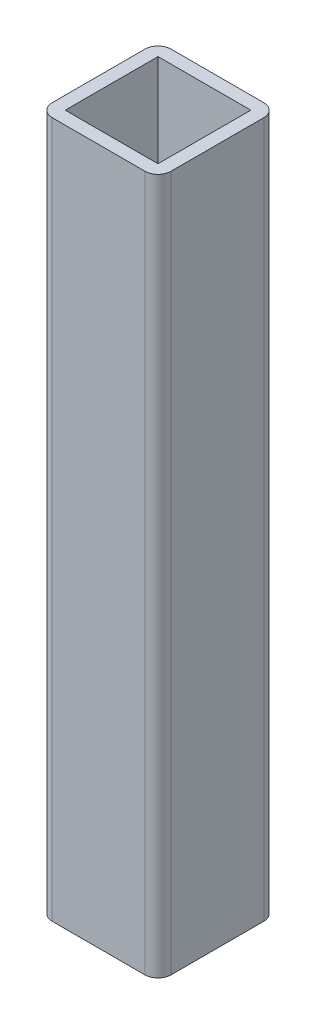
ISO-10303-21;
HEADER;
FILE_DESCRIPTION(('STEP AP214'),'2;1');
FILE_NAME('part.step','',(''),(''),'','','');
FILE_SCHEMA(('AUTOMOTIVE_DESIGN { 1 0 10303 214 1 1 1 1 }'));
ENDSEC;
DATA;
#1=APPLICATION_CONTEXT('core data for automotive mechanical design processes');
#2=APPLICATION_PROTOCOL_DEFINITION('international standard','automotive_design',2000,#1);
#3=PRODUCT_CONTEXT('',#1,'mechanical');
#4=PRODUCT('Part','Part','',(#3));
#5=PRODUCT_RELATED_PRODUCT_CATEGORY('part','',(#4));
#6=PRODUCT_DEFINITION_FORMATION('','',#4);
#7=PRODUCT_DEFINITION_CONTEXT('part definition',#1,'design');
#8=PRODUCT_DEFINITION('design','',#6,#7);
#9=PRODUCT_DEFINITION_SHAPE('','',#8);
#10=(LENGTH_UNIT() NAMED_UNIT(*) SI_UNIT(.MILLI.,.METRE.));
#11=(NAMED_UNIT(*) PLANE_ANGLE_UNIT() SI_UNIT($,.RADIAN.));
#12=(NAMED_UNIT(*) SI_UNIT($,.STERADIAN.) SOLID_ANGLE_UNIT());
#13=UNCERTAINTY_MEASURE_WITH_UNIT(LENGTH_MEASURE(1.E-05),#10,'distance_accuracy_value','');
#14=(GEOMETRIC_REPRESENTATION_CONTEXT(3) GLOBAL_UNCERTAINTY_ASSIGNED_CONTEXT((#13)) GLOBAL_UNIT_ASSIGNED_CONTEXT((#10,
#11,#12)) REPRESENTATION_CONTEXT('',''));
#15=CARTESIAN_POINT('',(0.,0.,0.));
#16=DIRECTION('',(0.,0.,1.));
#17=DIRECTION('',(1.,0.,0.));
#18=AXIS2_PLACEMENT_3D('',#15,#16,#17);
#19=CARTESIAN_POINT('',(22.8,150.,2.8));
#20=DIRECTION('',(0.,-1.,0.));
#21=DIRECTION('',(0.,0.,-1.));
#22=AXIS2_PLACEMENT_3D('',#19,#20,#21);
#23=CYLINDRICAL_SURFACE('',#22,2.8);
#24=CARTESIAN_POINT('',(22.8,0.,2.8));
#25=DIRECTION('',(0.,1.,0.));
#26=DIRECTION('',(0.,0.,-1.));
#27=AXIS2_PLACEMENT_3D('',#24,#25,#26);
#28=CIRCLE('',#27,2.8);
#29=CARTESIAN_POINT('',(25.6,0.,2.80000000000002));
#30=VERTEX_POINT('',#29);
#31=CARTESIAN_POINT('',(22.8,0.,0.));
#32=VERTEX_POINT('',#31);
#33=EDGE_CURVE('E159',#30,#32,#28,.T.);
#34=ORIENTED_EDGE('',*,*,#33,.T.);
#35=DIRECTION('',(0.,-1.,0.));
#36=VECTOR('',#35,1.);
#37=CARTESIAN_POINT('',(22.8,150.,0.));
#38=LINE('',#37,#36);
#39=CARTESIAN_POINT('',(22.8,150.,0.));
#40=VERTEX_POINT('',#39);
#41=EDGE_CURVE('E11',#40,#32,#38,.T.);
#42=ORIENTED_EDGE('',*,*,#41,.F.);
#43=CARTESIAN_POINT('',(22.8,150.,2.8));
#44=DIRECTION('',(0.,1.,0.));
#45=DIRECTION('',(0.,0.,-1.));
#46=AXIS2_PLACEMENT_3D('',#43,#44,#45);
#47=CIRCLE('',#46,2.8);
#48=CARTESIAN_POINT('',(25.6,150.,2.80000000000002));
#49=VERTEX_POINT('',#48);
#50=EDGE_CURVE('E160',#49,#40,#47,.T.);
#51=ORIENTED_EDGE('',*,*,#50,.F.);
#52=DIRECTION('',(0.,-1.,0.));
#53=VECTOR('',#52,1.);
#54=CARTESIAN_POINT('',(25.6,150.,2.80000000000002));
#55=LINE('',#54,#53);
#56=EDGE_CURVE('E178',#49,#30,#55,.T.);
#57=ORIENTED_EDGE('',*,*,#56,.T.);
#58=EDGE_LOOP('',(#34,#42,#51,#57));
#59=FACE_BOUND('',#58,.T.);
#60=ADVANCED_FACE('F34',(#59),#23,.T.);
#61=CARTESIAN_POINT('',(2.80000000000002,150.,0.));
#62=DIRECTION('',(0.,0.,1.));
#63=DIRECTION('',(1.,0.,0.));
#64=AXIS2_PLACEMENT_3D('',#61,#62,#63);
#65=PLANE('',#64);
#66=DIRECTION('',(-1.,0.,0.));
#67=VECTOR('',#66,1.);
#68=CARTESIAN_POINT('',(2.80000000000002,0.,0.));
#69=LINE('',#68,#67);
#70=CARTESIAN_POINT('',(2.80000000000002,0.,0.));
#71=VERTEX_POINT('',#70);
#72=EDGE_CURVE('E181',#32,#71,#69,.T.);
#73=ORIENTED_EDGE('',*,*,#72,.T.);
#74=DIRECTION('',(0.,-1.,0.));
#75=VECTOR('',#74,1.);
#76=CARTESIAN_POINT('',(2.80000000000002,150.,0.));
#77=LINE('',#76,#75);
#78=CARTESIAN_POINT('',(2.80000000000002,150.,0.));
#79=VERTEX_POINT('',#78);
#80=EDGE_CURVE('E41',#79,#71,#77,.T.);
#81=ORIENTED_EDGE('',*,*,#80,.F.);
#82=DIRECTION('',(-1.,0.,0.));
#83=VECTOR('',#82,1.);
#84=CARTESIAN_POINT('',(2.80000000000002,150.,0.));
#85=LINE('',#84,#83);
#86=EDGE_CURVE('E163',#40,#79,#85,.T.);
#87=ORIENTED_EDGE('',*,*,#86,.F.);
#88=ORIENTED_EDGE('',*,*,#41,.T.);
#89=EDGE_LOOP('',(#73,#81,#87,#88));
#90=FACE_BOUND('',#89,.T.);
#91=ADVANCED_FACE('F236',(#90),#65,.F.);
#92=CARTESIAN_POINT('',(2.8,150.,2.8));
#93=DIRECTION('',(0.,-1.,0.));
#94=DIRECTION('',(0.,0.,-1.));
#95=AXIS2_PLACEMENT_3D('',#92,#93,#94);
#96=CYLINDRICAL_SURFACE('',#95,2.8);
#97=CARTESIAN_POINT('',(2.8,0.,2.8));
#98=DIRECTION('',(0.,1.,0.));
#99=DIRECTION('',(0.,0.,1.));
#100=AXIS2_PLACEMENT_3D('',#97,#98,#99);
#101=CIRCLE('',#100,2.8);
#102=CARTESIAN_POINT('',(0.,0.,2.80000000000002));
#103=VERTEX_POINT('',#102);
#104=EDGE_CURVE('E183',#71,#103,#101,.T.);
#105=ORIENTED_EDGE('',*,*,#104,.T.);
#106=DIRECTION('',(0.,-1.,0.));
#107=VECTOR('',#106,1.);
#108=CARTESIAN_POINT('',(0.,150.,2.80000000000002));
#109=LINE('',#108,#107);
#110=CARTESIAN_POINT('',(0.,150.,2.80000000000002));
#111=VERTEX_POINT('',#110);
#112=EDGE_CURVE('E208',#111,#103,#109,.T.);
#113=ORIENTED_EDGE('',*,*,#112,.F.);
#114=CARTESIAN_POINT('',(2.8,150.,2.8));
#115=DIRECTION('',(0.,1.,0.));
#116=DIRECTION('',(0.,0.,1.));
#117=AXIS2_PLACEMENT_3D('',#114,#115,#116);
#118=CIRCLE('',#117,2.8);
#119=EDGE_CURVE('E166',#79,#111,#118,.T.);
#120=ORIENTED_EDGE('',*,*,#119,.F.);
#121=ORIENTED_EDGE('',*,*,#80,.T.);
#122=EDGE_LOOP('',(#105,#113,#120,#121));
#123=FACE_BOUND('',#122,.T.);
#124=ADVANCED_FACE('F215',(#123),#96,.T.);
#125=CARTESIAN_POINT('',(0.,150.,2.80000000000002));
#126=DIRECTION('',(1.,0.,0.));
#127=DIRECTION('',(0.,0.,-1.));
#128=AXIS2_PLACEMENT_3D('',#125,#126,#127);
#129=PLANE('',#128);
#130=DIRECTION('',(0.,0.,1.));
#131=VECTOR('',#130,1.);
#132=CARTESIAN_POINT('',(0.,0.,2.80000000000002));
#133=LINE('',#132,#131);
#134=CARTESIAN_POINT('',(0.,0.,22.8));
#135=VERTEX_POINT('',#134);
#136=EDGE_CURVE('E185',#103,#135,#133,.T.);
#137=ORIENTED_EDGE('',*,*,#136,.T.);
#138=DIRECTION('',(0.,-1.,0.));
#139=VECTOR('',#138,1.);
#140=CARTESIAN_POINT('',(0.,150.,22.8));
#141=LINE('',#140,#139);
#142=CARTESIAN_POINT('',(0.,150.,22.8));
#143=VERTEX_POINT('',#142);
#144=EDGE_CURVE('E205',#143,#135,#141,.T.);
#145=ORIENTED_EDGE('',*,*,#144,.F.);
#146=DIRECTION('',(0.,0.,1.));
#147=VECTOR('',#146,1.);
#148=CARTESIAN_POINT('',(0.,150.,2.80000000000002));
#149=LINE('',#148,#147);
#150=EDGE_CURVE('E168',#111,#143,#149,.T.);
#151=ORIENTED_EDGE('',*,*,#150,.F.);
#152=ORIENTED_EDGE('',*,*,#112,.T.);
#153=EDGE_LOOP('',(#137,#145,#151,#152));
#154=FACE_BOUND('',#153,.T.);
#155=ADVANCED_FACE('F224',(#154),#129,.F.);
#156=CARTESIAN_POINT('',(2.8,150.,22.8));
#157=DIRECTION('',(0.,-1.,0.));
#158=DIRECTION('',(0.,0.,-1.));
#159=AXIS2_PLACEMENT_3D('',#156,#157,#158);
#160=CYLINDRICAL_SURFACE('',#159,2.8);
#161=CARTESIAN_POINT('',(2.8,0.,22.8));
#162=DIRECTION('',(0.,1.,0.));
#163=DIRECTION('',(0.,0.,1.));
#164=AXIS2_PLACEMENT_3D('',#161,#162,#163);
#165=CIRCLE('',#164,2.8);
#166=CARTESIAN_POINT('',(2.80000000000002,0.,25.6));
#167=VERTEX_POINT('',#166);
#168=EDGE_CURVE('E187',#135,#167,#165,.T.);
#169=ORIENTED_EDGE('',*,*,#168,.T.);
#170=DIRECTION('',(0.,-1.,0.));
#171=VECTOR('',#170,1.);
#172=CARTESIAN_POINT('',(2.80000000000002,150.,25.6));
#173=LINE('',#172,#171);
#174=CARTESIAN_POINT('',(2.80000000000002,150.,25.6));
#175=VERTEX_POINT('',#174);
#176=EDGE_CURVE('E202',#175,#167,#173,.T.);
#177=ORIENTED_EDGE('',*,*,#176,.F.);
#178=CARTESIAN_POINT('',(2.8,150.,22.8));
#179=DIRECTION('',(0.,1.,0.));
#180=DIRECTION('',(0.,0.,1.));
#181=AXIS2_PLACEMENT_3D('',#178,#179,#180);
#182=CIRCLE('',#181,2.8);
#183=EDGE_CURVE('E170',#143,#175,#182,.T.);
#184=ORIENTED_EDGE('',*,*,#183,.F.);
#185=ORIENTED_EDGE('',*,*,#144,.T.);
#186=EDGE_LOOP('',(#169,#177,#184,#185));
#187=FACE_BOUND('',#186,.T.);
#188=ADVANCED_FACE('F228',(#187),#160,.T.);
#189=CARTESIAN_POINT('',(2.80000000000002,150.,25.6));
#190=DIRECTION('',(0.,0.,-1.));
#191=DIRECTION('',(-1.,0.,0.));
#192=AXIS2_PLACEMENT_3D('',#189,#190,#191);
#193=PLANE('',#192);
#194=DIRECTION('',(1.,0.,0.));
#195=VECTOR('',#194,1.);
#196=CARTESIAN_POINT('',(2.80000000000002,0.,25.6));
#197=LINE('',#196,#195);
#198=CARTESIAN_POINT('',(22.8,0.,25.6));
#199=VERTEX_POINT('',#198);
#200=EDGE_CURVE('E189',#167,#199,#197,.T.);
#201=ORIENTED_EDGE('',*,*,#200,.T.);
#202=DIRECTION('',(0.,-1.,0.));
#203=VECTOR('',#202,1.);
#204=CARTESIAN_POINT('',(22.8,150.,25.6));
#205=LINE('',#204,#203);
#206=CARTESIAN_POINT('',(22.8,150.,25.6));
#207=VERTEX_POINT('',#206);
#208=EDGE_CURVE('E199',#207,#199,#205,.T.);
#209=ORIENTED_EDGE('',*,*,#208,.F.);
#210=DIRECTION('',(1.,0.,0.));
#211=VECTOR('',#210,1.);
#212=CARTESIAN_POINT('',(2.80000000000002,150.,25.6));
#213=LINE('',#212,#211);
#214=EDGE_CURVE('E172',#175,#207,#213,.T.);
#215=ORIENTED_EDGE('',*,*,#214,.F.);
#216=ORIENTED_EDGE('',*,*,#176,.T.);
#217=EDGE_LOOP('',(#201,#209,#215,#216));
#218=FACE_BOUND('',#217,.T.);
#219=ADVANCED_FACE('F249',(#218),#193,.F.);
#220=CARTESIAN_POINT('',(22.8,150.,22.8));
#221=DIRECTION('',(0.,-1.,0.));
#222=DIRECTION('',(0.,0.,-1.));
#223=AXIS2_PLACEMENT_3D('',#220,#221,#222);
#224=CYLINDRICAL_SURFACE('',#223,2.8);
#225=CARTESIAN_POINT('',(22.8,0.,22.8));
#226=DIRECTION('',(0.,1.,0.));
#227=DIRECTION('',(0.,0.,1.));
#228=AXIS2_PLACEMENT_3D('',#225,#226,#227);
#229=CIRCLE('',#228,2.8);
#230=CARTESIAN_POINT('',(25.6,0.,22.8));
#231=VERTEX_POINT('',#230);
#232=EDGE_CURVE('E191',#199,#231,#229,.T.);
#233=ORIENTED_EDGE('',*,*,#232,.T.);
#234=DIRECTION('',(0.,-1.,0.));
#235=VECTOR('',#234,1.);
#236=CARTESIAN_POINT('',(25.6,150.,22.8));
#237=LINE('',#236,#235);
#238=CARTESIAN_POINT('',(25.6,150.,22.8));
#239=VERTEX_POINT('',#238);
#240=EDGE_CURVE('E196',#239,#231,#237,.T.);
#241=ORIENTED_EDGE('',*,*,#240,.F.);
#242=CARTESIAN_POINT('',(22.8,150.,22.8));
#243=DIRECTION('',(0.,1.,0.));
#244=DIRECTION('',(0.,0.,1.));
#245=AXIS2_PLACEMENT_3D('',#242,#243,#244);
#246=CIRCLE('',#245,2.8);
#247=EDGE_CURVE('E174',#207,#239,#246,.T.);
#248=ORIENTED_EDGE('',*,*,#247,.F.);
#249=ORIENTED_EDGE('',*,*,#208,.T.);
#250=EDGE_LOOP('',(#233,#241,#248,#249));
#251=FACE_BOUND('',#250,.T.);
#252=ADVANCED_FACE('F247',(#251),#224,.T.);
#253=CARTESIAN_POINT('',(25.6,150.,2.80000000000002));
#254=DIRECTION('',(-1.,0.,0.));
#255=DIRECTION('',(0.,0.,1.));
#256=AXIS2_PLACEMENT_3D('',#253,#254,#255);
#257=PLANE('',#256);
#258=DIRECTION('',(0.,0.,-1.));
#259=VECTOR('',#258,1.);
#260=CARTESIAN_POINT('',(25.6,0.,2.80000000000002));
#261=LINE('',#260,#259);
#262=EDGE_CURVE('E164',#231,#30,#261,.T.);
#263=ORIENTED_EDGE('',*,*,#262,.T.);
#264=ORIENTED_EDGE('',*,*,#56,.F.);
#265=DIRECTION('',(0.,0.,-1.));
#266=VECTOR('',#265,1.);
#267=CARTESIAN_POINT('',(25.6,150.,2.80000000000002));
#268=LINE('',#267,#266);
#269=EDGE_CURVE('E176',#239,#49,#268,.T.);
#270=ORIENTED_EDGE('',*,*,#269,.F.);
#271=ORIENTED_EDGE('',*,*,#240,.T.);
#272=EDGE_LOOP('',(#263,#264,#270,#271));
#273=FACE_BOUND('',#272,.T.);
#274=ADVANCED_FACE('F242',(#273),#257,.F.);
#275=CARTESIAN_POINT('',(22.8,150.,2.8));
#276=DIRECTION('',(0.,-1.,0.));
#277=DIRECTION('',(0.,0.,-1.));
#278=AXIS2_PLACEMENT_3D('',#275,#276,#277);
#279=PLANE('',#278);
#280=DIRECTION('',(1.,0.,0.));
#281=VECTOR('',#280,1.);
#282=CARTESIAN_POINT('',(22.8,150.,2.8));
#283=LINE('',#282,#281);
#284=CARTESIAN_POINT('',(2.8,150.,2.8));
#285=VERTEX_POINT('',#284);
#286=CARTESIAN_POINT('',(22.8,150.,2.8));
#287=VERTEX_POINT('',#286);
#288=EDGE_CURVE('E153',#285,#287,#283,.T.);
#289=ORIENTED_EDGE('',*,*,#288,.T.);
#290=DIRECTION('',(0.,0.,1.));
#291=VECTOR('',#290,1.);
#292=CARTESIAN_POINT('',(22.8,150.,2.8));
#293=LINE('',#292,#291);
#294=CARTESIAN_POINT('',(22.8,150.,22.8));
#295=VERTEX_POINT('',#294);
#296=EDGE_CURVE('E156',#287,#295,#293,.T.);
#297=ORIENTED_EDGE('',*,*,#296,.T.);
#298=DIRECTION('',(-1.,0.,0.));
#299=VECTOR('',#298,1.);
#300=CARTESIAN_POINT('',(22.8,150.,22.8));
#301=LINE('',#300,#299);
#302=CARTESIAN_POINT('',(2.8,150.,22.8));
#303=VERTEX_POINT('',#302);
#304=EDGE_CURVE('E148',#295,#303,#301,.T.);
#305=ORIENTED_EDGE('',*,*,#304,.T.);
#306=DIRECTION('',(0.,0.,-1.));
#307=VECTOR('',#306,1.);
#308=CARTESIAN_POINT('',(2.8,150.,2.79999999999999));
#309=LINE('',#308,#307);
#310=EDGE_CURVE('E128',#303,#285,#309,.T.);
#311=ORIENTED_EDGE('',*,*,#310,.T.);
#312=EDGE_LOOP('',(#289,#297,#305,#311));
#313=FACE_BOUND('',#312,.T.);
#314=ORIENTED_EDGE('',*,*,#50,.T.);
#315=ORIENTED_EDGE('',*,*,#86,.T.);
#316=ORIENTED_EDGE('',*,*,#119,.T.);
#317=ORIENTED_EDGE('',*,*,#150,.T.);
#318=ORIENTED_EDGE('',*,*,#183,.T.);
#319=ORIENTED_EDGE('',*,*,#214,.T.);
#320=ORIENTED_EDGE('',*,*,#247,.T.);
#321=ORIENTED_EDGE('',*,*,#269,.T.);
#322=EDGE_LOOP('',(#314,#315,#316,#317,#318,#319,#320,#321));
#323=FACE_BOUND('',#322,.T.);
#324=ADVANCED_FACE('F232',(#313,#323),#279,.F.);
#325=CARTESIAN_POINT('',(22.8,0.,2.8));
#326=DIRECTION('',(0.,-1.,0.));
#327=DIRECTION('',(0.,0.,-1.));
#328=AXIS2_PLACEMENT_3D('',#325,#326,#327);
#329=PLANE('',#328);
#330=DIRECTION('',(0.,0.,1.));
#331=VECTOR('',#330,1.);
#332=CARTESIAN_POINT('',(22.8,0.,2.8));
#333=LINE('',#332,#331);
#334=CARTESIAN_POINT('',(22.8,0.,2.8));
#335=VERTEX_POINT('',#334);
#336=CARTESIAN_POINT('',(22.8,0.,22.8));
#337=VERTEX_POINT('',#336);
#338=EDGE_CURVE('E56',#335,#337,#333,.T.);
#339=ORIENTED_EDGE('',*,*,#338,.F.);
#340=DIRECTION('',(1.,0.,0.));
#341=VECTOR('',#340,1.);
#342=CARTESIAN_POINT('',(2.8,0.,2.8));
#343=LINE('',#342,#341);
#344=CARTESIAN_POINT('',(2.8,0.,2.8));
#345=VERTEX_POINT('',#344);
#346=EDGE_CURVE('E141',#345,#335,#343,.T.);
#347=ORIENTED_EDGE('',*,*,#346,.F.);
#348=DIRECTION('',(0.,0.,-1.));
#349=VECTOR('',#348,1.);
#350=CARTESIAN_POINT('',(2.8,0.,2.8));
#351=LINE('',#350,#349);
#352=CARTESIAN_POINT('',(2.8,0.,22.8));
#353=VERTEX_POINT('',#352);
#354=EDGE_CURVE('E125',#353,#345,#351,.T.);
#355=ORIENTED_EDGE('',*,*,#354,.F.);
#356=DIRECTION('',(-1.,0.,0.));
#357=VECTOR('',#356,1.);
#358=CARTESIAN_POINT('',(2.8,0.,22.8));
#359=LINE('',#358,#357);
#360=EDGE_CURVE('E134',#337,#353,#359,.T.);
#361=ORIENTED_EDGE('',*,*,#360,.F.);
#362=EDGE_LOOP('',(#339,#347,#355,#361));
#363=FACE_BOUND('',#362,.T.);
#364=ORIENTED_EDGE('',*,*,#33,.F.);
#365=ORIENTED_EDGE('',*,*,#262,.F.);
#366=ORIENTED_EDGE('',*,*,#232,.F.);
#367=ORIENTED_EDGE('',*,*,#200,.F.);
#368=ORIENTED_EDGE('',*,*,#168,.F.);
#369=ORIENTED_EDGE('',*,*,#136,.F.);
#370=ORIENTED_EDGE('',*,*,#104,.F.);
#371=ORIENTED_EDGE('',*,*,#72,.F.);
#372=EDGE_LOOP('',(#364,#365,#366,#367,#368,#369,#370,#371));
#373=FACE_BOUND('',#372,.T.);
#374=ADVANCED_FACE('F138',(#363,#373),#329,.T.);
#375=CARTESIAN_POINT('',(22.8,1040.5,2.8));
#376=DIRECTION('',(1.,0.,0.));
#377=DIRECTION('',(0.,0.,-1.));
#378=AXIS2_PLACEMENT_3D('',#375,#376,#377);
#379=PLANE('',#378);
#380=DIRECTION('',(0.,-1.,0.));
#381=VECTOR('',#380,1.);
#382=CARTESIAN_POINT('',(22.8,1040.5,2.8));
#383=LINE('',#382,#381);
#384=EDGE_CURVE('E146',#287,#335,#383,.T.);
#385=ORIENTED_EDGE('',*,*,#384,.T.);
#386=ORIENTED_EDGE('',*,*,#338,.T.);
#387=DIRECTION('',(0.,-1.,0.));
#388=VECTOR('',#387,1.);
#389=CARTESIAN_POINT('',(22.8,1040.5,22.8));
#390=LINE('',#389,#388);
#391=EDGE_CURVE('E131',#295,#337,#390,.T.);
#392=ORIENTED_EDGE('',*,*,#391,.F.);
#393=ORIENTED_EDGE('',*,*,#296,.F.);
#394=EDGE_LOOP('',(#385,#386,#392,#393));
#395=FACE_BOUND('',#394,.T.);
#396=ADVANCED_FACE('F312',(#395),#379,.F.);
#397=CARTESIAN_POINT('',(2.8,1040.5,2.8));
#398=DIRECTION('',(0.,0.,-1.));
#399=DIRECTION('',(-1.,0.,0.));
#400=AXIS2_PLACEMENT_3D('',#397,#398,#399);
#401=PLANE('',#400);
#402=DIRECTION('',(0.,-1.,0.));
#403=VECTOR('',#402,1.);
#404=CARTESIAN_POINT('',(2.8,1040.5,2.8));
#405=LINE('',#404,#403);
#406=EDGE_CURVE('E130',#285,#345,#405,.T.);
#407=ORIENTED_EDGE('',*,*,#406,.T.);
#408=ORIENTED_EDGE('',*,*,#346,.T.);
#409=ORIENTED_EDGE('',*,*,#384,.F.);
#410=ORIENTED_EDGE('',*,*,#288,.F.);
#411=EDGE_LOOP('',(#407,#408,#409,#410));
#412=FACE_BOUND('',#411,.T.);
#413=ADVANCED_FACE('F321',(#412),#401,.F.);
#414=CARTESIAN_POINT('',(2.8,1040.5,2.8));
#415=DIRECTION('',(-1.,0.,0.));
#416=DIRECTION('',(0.,0.,1.));
#417=AXIS2_PLACEMENT_3D('',#414,#415,#416);
#418=PLANE('',#417);
#419=DIRECTION('',(0.,-1.,0.));
#420=VECTOR('',#419,1.);
#421=CARTESIAN_POINT('',(2.8,1040.5,22.8));
#422=LINE('',#421,#420);
#423=EDGE_CURVE('E48',#303,#353,#422,.T.);
#424=ORIENTED_EDGE('',*,*,#423,.T.);
#425=ORIENTED_EDGE('',*,*,#354,.T.);
#426=ORIENTED_EDGE('',*,*,#406,.F.);
#427=ORIENTED_EDGE('',*,*,#310,.F.);
#428=EDGE_LOOP('',(#424,#425,#426,#427));
#429=FACE_BOUND('',#428,.T.);
#430=ADVANCED_FACE('F122',(#429),#418,.F.);
#431=CARTESIAN_POINT('',(2.8,1040.5,22.8));
#432=DIRECTION('',(0.,0.,1.));
#433=DIRECTION('',(1.,0.,0.));
#434=AXIS2_PLACEMENT_3D('',#431,#432,#433);
#435=PLANE('',#434);
#436=ORIENTED_EDGE('',*,*,#391,.T.);
#437=ORIENTED_EDGE('',*,*,#360,.T.);
#438=ORIENTED_EDGE('',*,*,#423,.F.);
#439=ORIENTED_EDGE('',*,*,#304,.F.);
#440=EDGE_LOOP('',(#436,#437,#438,#439));
#441=FACE_BOUND('',#440,.T.);
#442=ADVANCED_FACE('F135',(#441),#435,.F.);
#443=CLOSED_SHELL('',(#60,#91,#124,#155,#188,#219,#252,#274,#324,#374,#396,#413,#430,#442));
#444=MANIFOLD_SOLID_BREP('B2',#443);
#445=ADVANCED_BREP_SHAPE_REPRESENTATION('',(#18,#444),#14);
#446=SHAPE_DEFINITION_REPRESENTATION(#9,#445);
ENDSEC;
END-ISO-10303-21;
